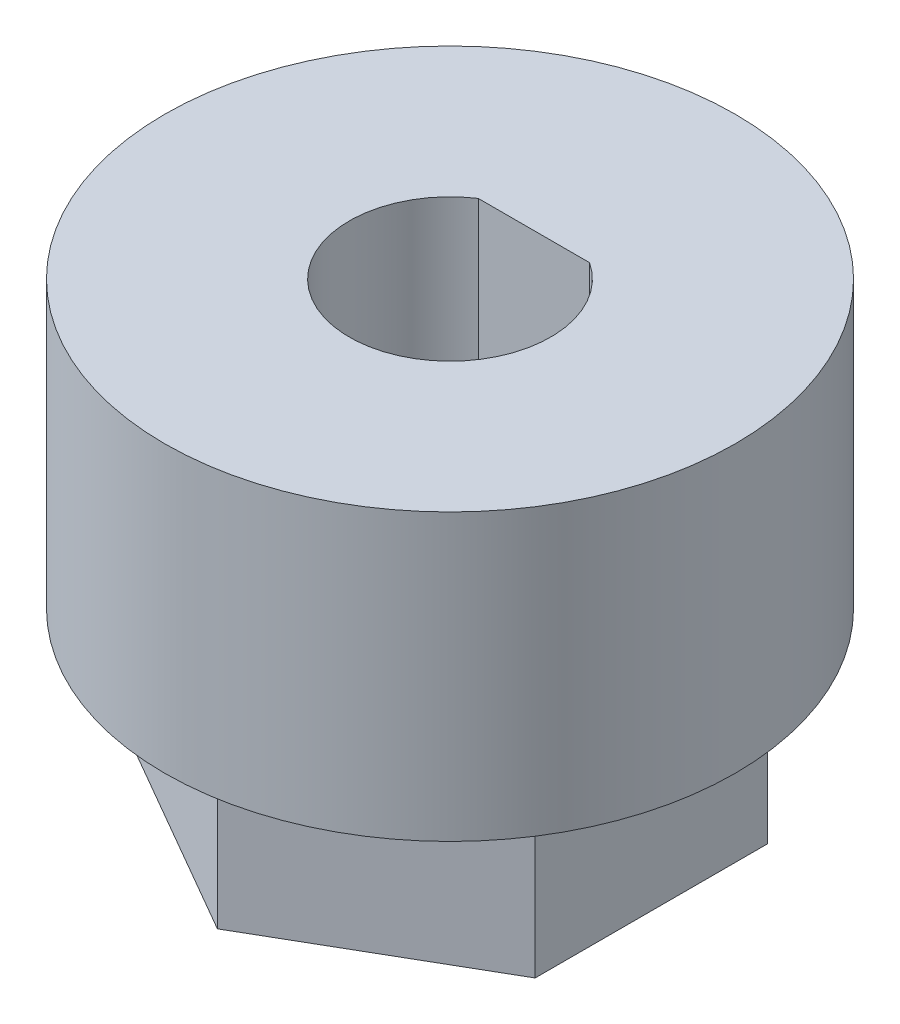
ISO-10303-21;
HEADER;
FILE_DESCRIPTION(('STEP AP214'),'2;1');
FILE_NAME('part.step','',(''),(''),'','','');
FILE_SCHEMA(('AUTOMOTIVE_DESIGN { 1 0 10303 214 1 1 1 1 }'));
ENDSEC;
DATA;
#1=APPLICATION_CONTEXT('core data for automotive mechanical design processes');
#2=APPLICATION_PROTOCOL_DEFINITION('international standard','automotive_design',2000,#1);
#3=PRODUCT_CONTEXT('',#1,'mechanical');
#4=PRODUCT('Part','Part','',(#3));
#5=PRODUCT_RELATED_PRODUCT_CATEGORY('part','',(#4));
#6=PRODUCT_DEFINITION_FORMATION('','',#4);
#7=PRODUCT_DEFINITION_CONTEXT('part definition',#1,'design');
#8=PRODUCT_DEFINITION('design','',#6,#7);
#9=PRODUCT_DEFINITION_SHAPE('','',#8);
#10=(LENGTH_UNIT() NAMED_UNIT(*) SI_UNIT(.MILLI.,.METRE.));
#11=(NAMED_UNIT(*) PLANE_ANGLE_UNIT() SI_UNIT($,.RADIAN.));
#12=(NAMED_UNIT(*) SI_UNIT($,.STERADIAN.) SOLID_ANGLE_UNIT());
#13=UNCERTAINTY_MEASURE_WITH_UNIT(LENGTH_MEASURE(1.E-05),#10,'distance_accuracy_value','');
#14=(GEOMETRIC_REPRESENTATION_CONTEXT(3) GLOBAL_UNCERTAINTY_ASSIGNED_CONTEXT((#13)) GLOBAL_UNIT_ASSIGNED_CONTEXT((#10,
#11,#12)) REPRESENTATION_CONTEXT('',''));
#15=CARTESIAN_POINT('',(0.,0.,0.));
#16=DIRECTION('',(0.,0.,1.));
#17=DIRECTION('',(1.,0.,0.));
#18=AXIS2_PLACEMENT_3D('',#15,#16,#17);
#19=CARTESIAN_POINT('',(0.,4.8,-6.9282032302755));
#20=DIRECTION('',(-0.499999999999998,0.,0.86602540378444));
#21=DIRECTION('',(0.86602540378444,0.,0.499999999999998));
#22=AXIS2_PLACEMENT_3D('',#19,#20,#21);
#23=PLANE('',#22);
#24=DIRECTION('',(-0.86602540378444,0.,-0.499999999999998));
#25=VECTOR('',#24,1.);
#26=CARTESIAN_POINT('',(0.,0.,-6.9282032302755));
#27=LINE('',#26,#25);
#28=CARTESIAN_POINT('',(5.99999999999997,0.,-3.46410161513778));
#29=VERTEX_POINT('',#28);
#30=CARTESIAN_POINT('',(0.,0.,-6.9282032302755));
#31=VERTEX_POINT('',#30);
#32=EDGE_CURVE('E136',#29,#31,#27,.T.);
#33=ORIENTED_EDGE('',*,*,#32,.T.);
#34=DIRECTION('',(0.,-1.,0.));
#35=VECTOR('',#34,1.);
#36=CARTESIAN_POINT('',(0.,4.8,-6.9282032302755));
#37=LINE('',#36,#35);
#38=CARTESIAN_POINT('',(0.,4.8,-6.9282032302755));
#39=VERTEX_POINT('',#38);
#40=EDGE_CURVE('E11',#39,#31,#37,.T.);
#41=ORIENTED_EDGE('',*,*,#40,.F.);
#42=DIRECTION('',(-0.86602540378444,0.,-0.499999999999998));
#43=VECTOR('',#42,1.);
#44=CARTESIAN_POINT('',(0.,4.8,-6.9282032302755));
#45=LINE('',#44,#43);
#46=CARTESIAN_POINT('',(5.99999999999997,4.8,-3.46410161513778));
#47=VERTEX_POINT('',#46);
#48=EDGE_CURVE('E140',#47,#39,#45,.T.);
#49=ORIENTED_EDGE('',*,*,#48,.F.);
#50=DIRECTION('',(0.,-1.,0.));
#51=VECTOR('',#50,1.);
#52=CARTESIAN_POINT('',(5.99999999999997,4.8,-3.46410161513778));
#53=LINE('',#52,#51);
#54=EDGE_CURVE('E165',#47,#29,#53,.T.);
#55=ORIENTED_EDGE('',*,*,#54,.T.);
#56=EDGE_LOOP('',(#33,#41,#49,#55));
#57=FACE_BOUND('',#56,.T.);
#58=ADVANCED_FACE('F43',(#57),#23,.F.);
#59=CARTESIAN_POINT('',(-6.00000000000003,4.8,-3.46410161513769));
#60=DIRECTION('',(0.500000000000004,0.,0.866025403784436));
#61=DIRECTION('',(0.866025403784436,0.,-0.500000000000004));
#62=AXIS2_PLACEMENT_3D('',#59,#60,#61);
#63=PLANE('',#62);
#64=DIRECTION('',(-0.866025403784436,0.,0.500000000000004));
#65=VECTOR('',#64,1.);
#66=CARTESIAN_POINT('',(-6.00000000000003,0.,-3.46410161513769));
#67=LINE('',#66,#65);
#68=CARTESIAN_POINT('',(-6.00000000000003,0.,-3.46410161513769));
#69=VERTEX_POINT('',#68);
#70=EDGE_CURVE('E169',#31,#69,#67,.T.);
#71=ORIENTED_EDGE('',*,*,#70,.T.);
#72=DIRECTION('',(0.,-1.,0.));
#73=VECTOR('',#72,1.);
#74=CARTESIAN_POINT('',(-6.00000000000003,4.8,-3.46410161513769));
#75=LINE('',#74,#73);
#76=CARTESIAN_POINT('',(-6.00000000000003,4.8,-3.46410161513769));
#77=VERTEX_POINT('',#76);
#78=EDGE_CURVE('E51',#77,#69,#75,.T.);
#79=ORIENTED_EDGE('',*,*,#78,.F.);
#80=DIRECTION('',(-0.866025403784436,0.,0.500000000000004));
#81=VECTOR('',#80,1.);
#82=CARTESIAN_POINT('',(-6.00000000000003,4.8,-3.46410161513769));
#83=LINE('',#82,#81);
#84=EDGE_CURVE('E144',#39,#77,#83,.T.);
#85=ORIENTED_EDGE('',*,*,#84,.F.);
#86=ORIENTED_EDGE('',*,*,#40,.T.);
#87=EDGE_LOOP('',(#71,#79,#85,#86));
#88=FACE_BOUND('',#87,.T.);
#89=ADVANCED_FACE('F218',(#88),#63,.F.);
#90=CARTESIAN_POINT('',(-5.99999999999997,4.8,3.46410161513778));
#91=DIRECTION('',(1.,0.,0.));
#92=DIRECTION('',(0.,0.,-1.));
#93=AXIS2_PLACEMENT_3D('',#90,#91,#92);
#94=PLANE('',#93);
#95=DIRECTION('',(0.,0.,1.));
#96=VECTOR('',#95,1.);
#97=CARTESIAN_POINT('',(-5.99999999999997,0.,3.46410161513778));
#98=LINE('',#97,#96);
#99=CARTESIAN_POINT('',(-5.99999999999997,0.,3.46410161513778));
#100=VERTEX_POINT('',#99);
#101=EDGE_CURVE('E172',#69,#100,#98,.T.);
#102=ORIENTED_EDGE('',*,*,#101,.T.);
#103=DIRECTION('',(0.,-1.,0.));
#104=VECTOR('',#103,1.);
#105=CARTESIAN_POINT('',(-5.99999999999997,4.8,3.46410161513778));
#106=LINE('',#105,#104);
#107=CARTESIAN_POINT('',(-5.99999999999997,4.8,3.46410161513778));
#108=VERTEX_POINT('',#107);
#109=EDGE_CURVE('E194',#108,#100,#106,.T.);
#110=ORIENTED_EDGE('',*,*,#109,.F.);
#111=DIRECTION('',(0.,0.,1.));
#112=VECTOR('',#111,1.);
#113=CARTESIAN_POINT('',(-5.99999999999997,4.8,3.46410161513778));
#114=LINE('',#113,#112);
#115=EDGE_CURVE('E149',#77,#108,#114,.T.);
#116=ORIENTED_EDGE('',*,*,#115,.F.);
#117=ORIENTED_EDGE('',*,*,#78,.T.);
#118=EDGE_LOOP('',(#102,#110,#116,#117));
#119=FACE_BOUND('',#118,.T.);
#120=ADVANCED_FACE('F202',(#119),#94,.F.);
#121=CARTESIAN_POINT('',(0.,4.8,6.9282032302755));
#122=DIRECTION('',(0.499999999999998,0.,-0.86602540378444));
#123=DIRECTION('',(-0.86602540378444,0.,-0.499999999999998));
#124=AXIS2_PLACEMENT_3D('',#121,#122,#123);
#125=PLANE('',#124);
#126=DIRECTION('',(0.86602540378444,0.,0.499999999999998));
#127=VECTOR('',#126,1.);
#128=CARTESIAN_POINT('',(0.,0.,6.9282032302755));
#129=LINE('',#128,#127);
#130=CARTESIAN_POINT('',(0.,0.,6.9282032302755));
#131=VERTEX_POINT('',#130);
#132=EDGE_CURVE('E175',#100,#131,#129,.T.);
#133=ORIENTED_EDGE('',*,*,#132,.T.);
#134=DIRECTION('',(0.,-1.,0.));
#135=VECTOR('',#134,1.);
#136=CARTESIAN_POINT('',(0.,4.8,6.9282032302755));
#137=LINE('',#136,#135);
#138=CARTESIAN_POINT('',(0.,4.8,6.9282032302755));
#139=VERTEX_POINT('',#138);
#140=EDGE_CURVE('E190',#139,#131,#137,.T.);
#141=ORIENTED_EDGE('',*,*,#140,.F.);
#142=DIRECTION('',(0.86602540378444,0.,0.499999999999998));
#143=VECTOR('',#142,1.);
#144=CARTESIAN_POINT('',(0.,4.8,6.9282032302755));
#145=LINE('',#144,#143);
#146=EDGE_CURVE('E153',#108,#139,#145,.T.);
#147=ORIENTED_EDGE('',*,*,#146,.F.);
#148=ORIENTED_EDGE('',*,*,#109,.T.);
#149=EDGE_LOOP('',(#133,#141,#147,#148));
#150=FACE_BOUND('',#149,.T.);
#151=ADVANCED_FACE('F209',(#150),#125,.F.);
#152=CARTESIAN_POINT('',(6.00000000000003,4.8,3.46410161513769));
#153=DIRECTION('',(-0.500000000000005,0.,-0.866025403784436));
#154=DIRECTION('',(-0.866025403784436,0.,0.500000000000005));
#155=AXIS2_PLACEMENT_3D('',#152,#153,#154);
#156=PLANE('',#155);
#157=DIRECTION('',(0.866025403784436,0.,-0.500000000000005));
#158=VECTOR('',#157,1.);
#159=CARTESIAN_POINT('',(6.00000000000003,0.,3.46410161513769));
#160=LINE('',#159,#158);
#161=CARTESIAN_POINT('',(6.00000000000003,0.,3.46410161513769));
#162=VERTEX_POINT('',#161);
#163=EDGE_CURVE('E178',#131,#162,#160,.T.);
#164=ORIENTED_EDGE('',*,*,#163,.T.);
#165=DIRECTION('',(0.,-1.,0.));
#166=VECTOR('',#165,1.);
#167=CARTESIAN_POINT('',(6.00000000000003,4.8,3.46410161513769));
#168=LINE('',#167,#166);
#169=CARTESIAN_POINT('',(6.00000000000003,4.8,3.46410161513769));
#170=VERTEX_POINT('',#169);
#171=EDGE_CURVE('E186',#170,#162,#168,.T.);
#172=ORIENTED_EDGE('',*,*,#171,.F.);
#173=DIRECTION('',(0.866025403784436,0.,-0.500000000000005));
#174=VECTOR('',#173,1.);
#175=CARTESIAN_POINT('',(6.00000000000003,4.8,3.46410161513769));
#176=LINE('',#175,#174);
#177=EDGE_CURVE('E157',#139,#170,#176,.T.);
#178=ORIENTED_EDGE('',*,*,#177,.F.);
#179=ORIENTED_EDGE('',*,*,#140,.T.);
#180=EDGE_LOOP('',(#164,#172,#178,#179));
#181=FACE_BOUND('',#180,.T.);
#182=ADVANCED_FACE('F213',(#181),#156,.F.);
#183=CARTESIAN_POINT('',(5.99999999999997,4.8,-3.46410161513778));
#184=DIRECTION('',(-1.,0.,0.));
#185=DIRECTION('',(0.,0.,1.));
#186=AXIS2_PLACEMENT_3D('',#183,#184,#185);
#187=PLANE('',#186);
#188=DIRECTION('',(0.,0.,-1.));
#189=VECTOR('',#188,1.);
#190=CARTESIAN_POINT('',(5.99999999999997,0.,-3.46410161513778));
#191=LINE('',#190,#189);
#192=EDGE_CURVE('E145',#162,#29,#191,.T.);
#193=ORIENTED_EDGE('',*,*,#192,.T.);
#194=ORIENTED_EDGE('',*,*,#54,.F.);
#195=DIRECTION('',(0.,0.,-1.));
#196=VECTOR('',#195,1.);
#197=CARTESIAN_POINT('',(5.99999999999997,4.8,-3.46410161513778));
#198=LINE('',#197,#196);
#199=EDGE_CURVE('E161',#170,#47,#198,.T.);
#200=ORIENTED_EDGE('',*,*,#199,.F.);
#201=ORIENTED_EDGE('',*,*,#171,.T.);
#202=EDGE_LOOP('',(#193,#194,#200,#201));
#203=FACE_BOUND('',#202,.T.);
#204=ADVANCED_FACE('F222',(#203),#187,.F.);
#205=CARTESIAN_POINT('',(0.,0.,0.));
#206=DIRECTION('',(0.,-1.,0.));
#207=DIRECTION('',(0.,0.,-1.));
#208=AXIS2_PLACEMENT_3D('',#205,#206,#207);
#209=PLANE('',#208);
#210=CARTESIAN_POINT('',(0.,0.,0.));
#211=DIRECTION('',(0.,1.,0.));
#212=DIRECTION('',(0.,0.,1.));
#213=AXIS2_PLACEMENT_3D('',#210,#211,#212);
#214=CIRCLE('',#213,3.);
#215=CARTESIAN_POINT('',(-1.6583123951777,0.,-2.5));
#216=VERTEX_POINT('',#215);
#217=CARTESIAN_POINT('',(1.6583123951777,0.,-2.5));
#218=VERTEX_POINT('',#217);
#219=EDGE_CURVE('E58',#216,#218,#214,.T.);
#220=ORIENTED_EDGE('',*,*,#219,.T.);
#221=DIRECTION('',(-1.,0.,0.));
#222=VECTOR('',#221,1.);
#223=CARTESIAN_POINT('',(-1.6583123951777,0.,-2.5));
#224=LINE('',#223,#222);
#225=EDGE_CURVE('E112',#218,#216,#224,.T.);
#226=ORIENTED_EDGE('',*,*,#225,.T.);
#227=EDGE_LOOP('',(#220,#226));
#228=FACE_BOUND('',#227,.T.);
#229=ORIENTED_EDGE('',*,*,#32,.F.);
#230=ORIENTED_EDGE('',*,*,#192,.F.);
#231=ORIENTED_EDGE('',*,*,#163,.F.);
#232=ORIENTED_EDGE('',*,*,#132,.F.);
#233=ORIENTED_EDGE('',*,*,#101,.F.);
#234=ORIENTED_EDGE('',*,*,#70,.F.);
#235=EDGE_LOOP('',(#229,#230,#231,#232,#233,#234));
#236=FACE_BOUND('',#235,.T.);
#237=ADVANCED_FACE('F119',(#228,#236),#209,.T.);
#238=CARTESIAN_POINT('',(0.,4.8,0.));
#239=DIRECTION('',(0.,1.,0.));
#240=DIRECTION('',(0.,0.,1.));
#241=AXIS2_PLACEMENT_3D('',#238,#239,#240);
#242=PLANE('',#241);
#243=CARTESIAN_POINT('',(0.,4.8,0.));
#244=DIRECTION('',(0.,1.,0.));
#245=DIRECTION('',(0.,0.,1.));
#246=AXIS2_PLACEMENT_3D('',#243,#244,#245);
#247=CIRCLE('',#246,8.5);
#248=CARTESIAN_POINT('',(0.,4.8,8.5));
#249=VERTEX_POINT('',#248);
#250=EDGE_CURVE('E130',#249,#249,#247,.T.);
#251=ORIENTED_EDGE('',*,*,#250,.F.);
#252=EDGE_LOOP('',(#251));
#253=FACE_BOUND('',#252,.T.);
#254=ORIENTED_EDGE('',*,*,#199,.T.);
#255=ORIENTED_EDGE('',*,*,#48,.T.);
#256=ORIENTED_EDGE('',*,*,#84,.T.);
#257=ORIENTED_EDGE('',*,*,#115,.T.);
#258=ORIENTED_EDGE('',*,*,#146,.T.);
#259=ORIENTED_EDGE('',*,*,#177,.T.);
#260=EDGE_LOOP('',(#254,#255,#256,#257,#258,#259));
#261=FACE_BOUND('',#260,.T.);
#262=ADVANCED_FACE('F216',(#253,#261),#242,.F.);
#263=CARTESIAN_POINT('',(0.,13.3,0.));
#264=DIRECTION('',(0.,-1.,0.));
#265=DIRECTION('',(0.,0.,-1.));
#266=AXIS2_PLACEMENT_3D('',#263,#264,#265);
#267=CYLINDRICAL_SURFACE('',#266,8.5);
#268=CARTESIAN_POINT('',(0.,13.3,0.));
#269=DIRECTION('',(0.,1.,0.));
#270=DIRECTION('',(0.,0.,1.));
#271=AXIS2_PLACEMENT_3D('',#268,#269,#270);
#272=CIRCLE('',#271,8.5);
#273=CARTESIAN_POINT('',(0.,13.3,8.5));
#274=VERTEX_POINT('',#273);
#275=EDGE_CURVE('E132',#274,#274,#272,.T.);
#276=ORIENTED_EDGE('',*,*,#275,.F.);
#277=EDGE_LOOP('',(#276));
#278=FACE_BOUND('',#277,.T.);
#279=ORIENTED_EDGE('',*,*,#250,.T.);
#280=EDGE_LOOP('',(#279));
#281=FACE_BOUND('',#280,.T.);
#282=ADVANCED_FACE('F265',(#278,#281),#267,.T.);
#283=CARTESIAN_POINT('',(0.,13.3,0.));
#284=DIRECTION('',(0.,1.,0.));
#285=DIRECTION('',(0.,0.,1.));
#286=AXIS2_PLACEMENT_3D('',#283,#284,#285);
#287=PLANE('',#286);
#288=CARTESIAN_POINT('',(0.,13.3,0.));
#289=DIRECTION('',(0.,1.,0.));
#290=DIRECTION('',(0.,0.,1.));
#291=AXIS2_PLACEMENT_3D('',#288,#289,#290);
#292=CIRCLE('',#291,3.);
#293=CARTESIAN_POINT('',(-1.6583123951777,13.3,-2.5));
#294=VERTEX_POINT('',#293);
#295=CARTESIAN_POINT('',(1.6583123951777,13.3,-2.5));
#296=VERTEX_POINT('',#295);
#297=EDGE_CURVE('E63',#294,#296,#292,.T.);
#298=ORIENTED_EDGE('',*,*,#297,.F.);
#299=DIRECTION('',(-1.,0.,0.));
#300=VECTOR('',#299,1.);
#301=CARTESIAN_POINT('',(-1.6583123951777,13.3,-2.5));
#302=LINE('',#301,#300);
#303=EDGE_CURVE('E122',#296,#294,#302,.T.);
#304=ORIENTED_EDGE('',*,*,#303,.F.);
#305=EDGE_LOOP('',(#298,#304));
#306=FACE_BOUND('',#305,.T.);
#307=ORIENTED_EDGE('',*,*,#275,.T.);
#308=EDGE_LOOP('',(#307));
#309=FACE_BOUND('',#308,.T.);
#310=ADVANCED_FACE('F276',(#306,#309),#287,.T.);
#311=CARTESIAN_POINT('',(0.,0.,0.));
#312=DIRECTION('',(0.,1.,0.));
#313=DIRECTION('',(0.,0.,1.));
#314=AXIS2_PLACEMENT_3D('',#311,#312,#313);
#315=CYLINDRICAL_SURFACE('',#314,3.);
#316=ORIENTED_EDGE('',*,*,#297,.T.);
#317=DIRECTION('',(0.,1.,0.));
#318=VECTOR('',#317,1.);
#319=CARTESIAN_POINT('',(1.6583123951777,0.,-2.5));
#320=LINE('',#319,#318);
#321=EDGE_CURVE('E104',#218,#296,#320,.T.);
#322=ORIENTED_EDGE('',*,*,#321,.F.);
#323=ORIENTED_EDGE('',*,*,#219,.F.);
#324=DIRECTION('',(0.,1.,0.));
#325=VECTOR('',#324,1.);
#326=CARTESIAN_POINT('',(-1.6583123951777,0.,-2.5));
#327=LINE('',#326,#325);
#328=EDGE_CURVE('E111',#216,#294,#327,.T.);
#329=ORIENTED_EDGE('',*,*,#328,.T.);
#330=EDGE_LOOP('',(#316,#322,#323,#329));
#331=FACE_BOUND('',#330,.T.);
#332=ADVANCED_FACE('F106',(#331),#315,.F.);
#333=CARTESIAN_POINT('',(-1.6583123951777,0.,-2.5));
#334=DIRECTION('',(0.,0.,-1.));
#335=DIRECTION('',(-1.,0.,0.));
#336=AXIS2_PLACEMENT_3D('',#333,#334,#335);
#337=PLANE('',#336);
#338=ORIENTED_EDGE('',*,*,#303,.T.);
#339=ORIENTED_EDGE('',*,*,#328,.F.);
#340=ORIENTED_EDGE('',*,*,#225,.F.);
#341=ORIENTED_EDGE('',*,*,#321,.T.);
#342=EDGE_LOOP('',(#338,#339,#340,#341));
#343=FACE_BOUND('',#342,.T.);
#344=ADVANCED_FACE('F115',(#343),#337,.F.);
#345=CLOSED_SHELL('',(#58,#89,#120,#151,#182,#204,#237,#262,#282,#310,#332,#344));
#346=MANIFOLD_SOLID_BREP('B2',#345);
#347=ADVANCED_BREP_SHAPE_REPRESENTATION('',(#18,#346),#14);
#348=SHAPE_DEFINITION_REPRESENTATION(#9,#347);
ENDSEC;
END-ISO-10303-21;
